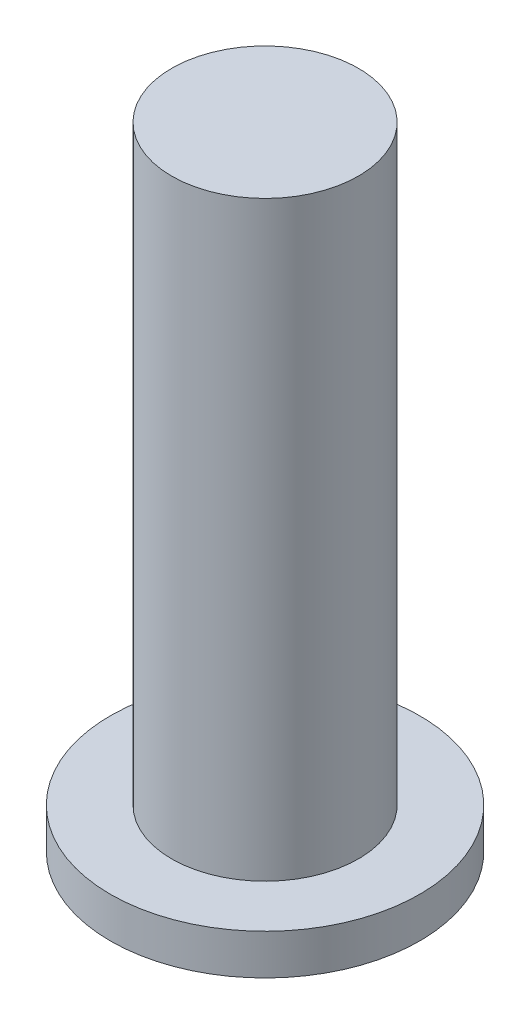
ISO-10303-21;
HEADER;
FILE_DESCRIPTION(('STEP AP214'),'2;1');
FILE_NAME('part.step','',(''),(''),'','','');
FILE_SCHEMA(('AUTOMOTIVE_DESIGN { 1 0 10303 214 1 1 1 1 }'));
ENDSEC;
DATA;
#1=APPLICATION_CONTEXT('core data for automotive mechanical design processes');
#2=APPLICATION_PROTOCOL_DEFINITION('international standard','automotive_design',2000,#1);
#3=PRODUCT_CONTEXT('',#1,'mechanical');
#4=PRODUCT('Part','Part','',(#3));
#5=PRODUCT_RELATED_PRODUCT_CATEGORY('part','',(#4));
#6=PRODUCT_DEFINITION_FORMATION('','',#4);
#7=PRODUCT_DEFINITION_CONTEXT('part definition',#1,'design');
#8=PRODUCT_DEFINITION('design','',#6,#7);
#9=PRODUCT_DEFINITION_SHAPE('','',#8);
#10=(LENGTH_UNIT() NAMED_UNIT(*) SI_UNIT(.MILLI.,.METRE.));
#11=(NAMED_UNIT(*) PLANE_ANGLE_UNIT() SI_UNIT($,.RADIAN.));
#12=(NAMED_UNIT(*) SI_UNIT($,.STERADIAN.) SOLID_ANGLE_UNIT());
#13=UNCERTAINTY_MEASURE_WITH_UNIT(LENGTH_MEASURE(1.E-05),#10,'distance_accuracy_value','');
#14=(GEOMETRIC_REPRESENTATION_CONTEXT(3) GLOBAL_UNCERTAINTY_ASSIGNED_CONTEXT((#13)) GLOBAL_UNIT_ASSIGNED_CONTEXT((#10,
#11,#12)) REPRESENTATION_CONTEXT('',''));
#15=CARTESIAN_POINT('',(0.,0.,0.));
#16=DIRECTION('',(0.,0.,1.));
#17=DIRECTION('',(1.,0.,0.));
#18=AXIS2_PLACEMENT_3D('',#15,#16,#17);
#19=CARTESIAN_POINT('',(0.,1.7,0.));
#20=DIRECTION('',(0.,-1.,0.));
#21=DIRECTION('',(0.,0.,-1.));
#22=AXIS2_PLACEMENT_3D('',#19,#20,#21);
#23=CYLINDRICAL_SURFACE('',#22,6.5);
#24=CARTESIAN_POINT('',(0.,1.7,0.));
#25=DIRECTION('',(0.,1.,0.));
#26=DIRECTION('',(0.,0.,1.));
#27=AXIS2_PLACEMENT_3D('',#24,#25,#26);
#28=CIRCLE('',#27,6.5);
#29=CARTESIAN_POINT('',(0.,1.7,6.5));
#30=VERTEX_POINT('',#29);
#31=EDGE_CURVE('E45',#30,#30,#28,.T.);
#32=ORIENTED_EDGE('',*,*,#31,.F.);
#33=EDGE_LOOP('',(#32));
#34=FACE_BOUND('',#33,.T.);
#35=CARTESIAN_POINT('',(0.,0.,0.));
#36=DIRECTION('',(0.,1.,0.));
#37=DIRECTION('',(0.,0.,1.));
#38=AXIS2_PLACEMENT_3D('',#35,#36,#37);
#39=CIRCLE('',#38,6.5);
#40=CARTESIAN_POINT('',(0.,0.,6.5));
#41=VERTEX_POINT('',#40);
#42=EDGE_CURVE('E40',#41,#41,#39,.T.);
#43=ORIENTED_EDGE('',*,*,#42,.T.);
#44=EDGE_LOOP('',(#43));
#45=FACE_BOUND('',#44,.T.);
#46=ADVANCED_FACE('F37',(#34,#45),#23,.T.);
#47=CARTESIAN_POINT('',(0.,1.7,0.));
#48=DIRECTION('',(0.,1.,0.));
#49=DIRECTION('',(0.,0.,1.));
#50=AXIS2_PLACEMENT_3D('',#47,#48,#49);
#51=PLANE('',#50);
#52=CARTESIAN_POINT('',(0.,1.7,0.));
#53=DIRECTION('',(0.,1.,0.));
#54=DIRECTION('',(0.,0.,1.));
#55=AXIS2_PLACEMENT_3D('',#52,#53,#54);
#56=CIRCLE('',#55,3.925);
#57=CARTESIAN_POINT('',(0.,1.7,3.925));
#58=VERTEX_POINT('',#57);
#59=EDGE_CURVE('E10',#58,#58,#56,.T.);
#60=ORIENTED_EDGE('',*,*,#59,.F.);
#61=EDGE_LOOP('',(#60));
#62=FACE_BOUND('',#61,.T.);
#63=ORIENTED_EDGE('',*,*,#31,.T.);
#64=EDGE_LOOP('',(#63));
#65=FACE_BOUND('',#64,.T.);
#66=ADVANCED_FACE('F65',(#62,#65),#51,.T.);
#67=CARTESIAN_POINT('',(0.,0.,0.));
#68=DIRECTION('',(0.,1.,0.));
#69=DIRECTION('',(0.,0.,1.));
#70=AXIS2_PLACEMENT_3D('',#67,#68,#69);
#71=PLANE('',#70);
#72=ORIENTED_EDGE('',*,*,#42,.F.);
#73=EDGE_LOOP('',(#72));
#74=FACE_BOUND('',#73,.T.);
#75=ADVANCED_FACE('F62',(#74),#71,.F.);
#76=CARTESIAN_POINT('',(0.,26.55,0.));
#77=DIRECTION('',(0.,-1.,0.));
#78=DIRECTION('',(0.,0.,-1.));
#79=AXIS2_PLACEMENT_3D('',#76,#77,#78);
#80=CYLINDRICAL_SURFACE('',#79,3.925);
#81=CARTESIAN_POINT('',(0.,26.55,0.));
#82=DIRECTION('',(0.,1.,0.));
#83=DIRECTION('',(0.,0.,1.));
#84=AXIS2_PLACEMENT_3D('',#81,#82,#83);
#85=CIRCLE('',#84,3.925);
#86=CARTESIAN_POINT('',(0.,26.55,3.925));
#87=VERTEX_POINT('',#86);
#88=EDGE_CURVE('E52',#87,#87,#85,.T.);
#89=ORIENTED_EDGE('',*,*,#88,.F.);
#90=EDGE_LOOP('',(#89));
#91=FACE_BOUND('',#90,.T.);
#92=ORIENTED_EDGE('',*,*,#59,.T.);
#93=EDGE_LOOP('',(#92));
#94=FACE_BOUND('',#93,.T.);
#95=ADVANCED_FACE('F64',(#91,#94),#80,.T.);
#96=CARTESIAN_POINT('',(0.,26.55,0.));
#97=DIRECTION('',(0.,1.,0.));
#98=DIRECTION('',(0.,0.,1.));
#99=AXIS2_PLACEMENT_3D('',#96,#97,#98);
#100=PLANE('',#99);
#101=ORIENTED_EDGE('',*,*,#88,.T.);
#102=EDGE_LOOP('',(#101));
#103=FACE_BOUND('',#102,.T.);
#104=ADVANCED_FACE('F70',(#103),#100,.T.);
#105=CLOSED_SHELL('',(#46,#66,#75,#95,#104));
#106=MANIFOLD_SOLID_BREP('B2',#105);
#107=ADVANCED_BREP_SHAPE_REPRESENTATION('',(#18,#106),#14);
#108=SHAPE_DEFINITION_REPRESENTATION(#9,#107);
ENDSEC;
END-ISO-10303-21;
